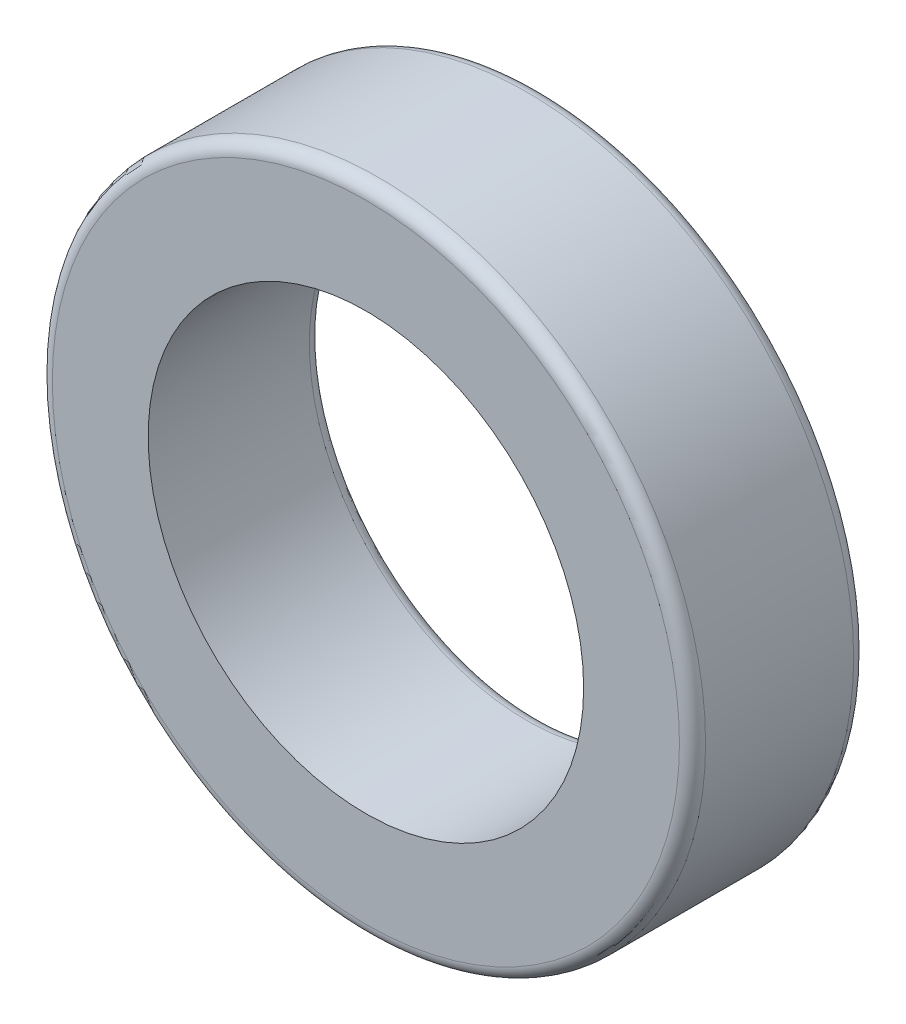
ISO-10303-21;
HEADER;
FILE_DESCRIPTION(('STEP AP214'),'2;1');
FILE_NAME('part.step','',(''),(''),'','','');
FILE_SCHEMA(('AUTOMOTIVE_DESIGN { 1 0 10303 214 1 1 1 1 }'));
ENDSEC;
DATA;
#1=APPLICATION_CONTEXT('core data for automotive mechanical design processes');
#2=APPLICATION_PROTOCOL_DEFINITION('international standard','automotive_design',2000,#1);
#3=PRODUCT_CONTEXT('',#1,'mechanical');
#4=PRODUCT('Part','Part','',(#3));
#5=PRODUCT_RELATED_PRODUCT_CATEGORY('part','',(#4));
#6=PRODUCT_DEFINITION_FORMATION('','',#4);
#7=PRODUCT_DEFINITION_CONTEXT('part definition',#1,'design');
#8=PRODUCT_DEFINITION('design','',#6,#7);
#9=PRODUCT_DEFINITION_SHAPE('','',#8);
#10=(LENGTH_UNIT() NAMED_UNIT(*) SI_UNIT(.MILLI.,.METRE.));
#11=(NAMED_UNIT(*) PLANE_ANGLE_UNIT() SI_UNIT($,.RADIAN.));
#12=(NAMED_UNIT(*) SI_UNIT($,.STERADIAN.) SOLID_ANGLE_UNIT());
#13=UNCERTAINTY_MEASURE_WITH_UNIT(LENGTH_MEASURE(1.E-05),#10,'distance_accuracy_value','');
#14=(GEOMETRIC_REPRESENTATION_CONTEXT(3) GLOBAL_UNCERTAINTY_ASSIGNED_CONTEXT((#13)) GLOBAL_UNIT_ASSIGNED_CONTEXT((#10,
#11,#12)) REPRESENTATION_CONTEXT('',''));
#15=CARTESIAN_POINT('',(0.,0.,0.));
#16=DIRECTION('',(0.,0.,1.));
#17=DIRECTION('',(1.,0.,0.));
#18=AXIS2_PLACEMENT_3D('',#15,#16,#17);
#19=CARTESIAN_POINT('',(0.,0.,2.));
#20=DIRECTION('',(0.,0.,1.));
#21=DIRECTION('',(1.,0.,0.));
#22=AXIS2_PLACEMENT_3D('',#19,#20,#21);
#23=PLANE('',#22);
#24=CARTESIAN_POINT('',(0.,0.,2.));
#25=DIRECTION('',(0.,0.,1.));
#26=DIRECTION('',(1.,0.,0.));
#27=AXIS2_PLACEMENT_3D('',#24,#25,#26);
#28=CIRCLE('',#27,7.2);
#29=CARTESIAN_POINT('',(7.2,0.,2.));
#30=VERTEX_POINT('',#29);
#31=EDGE_CURVE('E50',#30,#30,#28,.T.);
#32=ORIENTED_EDGE('',*,*,#31,.T.);
#33=EDGE_LOOP('',(#32));
#34=FACE_BOUND('',#33,.T.);
#35=CARTESIAN_POINT('',(0.,0.,2.));
#36=DIRECTION('',(0.,0.,1.));
#37=DIRECTION('',(1.,0.,0.));
#38=AXIS2_PLACEMENT_3D('',#35,#36,#37);
#39=CIRCLE('',#38,5.);
#40=CARTESIAN_POINT('',(5.,0.,2.));
#41=VERTEX_POINT('',#40);
#42=EDGE_CURVE('E69',#41,#41,#39,.T.);
#43=ORIENTED_EDGE('',*,*,#42,.F.);
#44=EDGE_LOOP('',(#43));
#45=FACE_BOUND('',#44,.T.);
#46=ADVANCED_FACE('F37',(#34,#45),#23,.T.);
#47=CARTESIAN_POINT('',(0.,0.,-2.));
#48=DIRECTION('',(0.,0.,1.));
#49=DIRECTION('',(1.,0.,0.));
#50=AXIS2_PLACEMENT_3D('',#47,#48,#49);
#51=PLANE('',#50);
#52=CARTESIAN_POINT('',(0.,0.,-2.));
#53=DIRECTION('',(0.,0.,1.));
#54=DIRECTION('',(1.,0.,0.));
#55=AXIS2_PLACEMENT_3D('',#52,#53,#54);
#56=CIRCLE('',#55,5.3);
#57=CARTESIAN_POINT('',(5.3,0.,-2.));
#58=VERTEX_POINT('',#57);
#59=EDGE_CURVE('E61',#58,#58,#56,.T.);
#60=ORIENTED_EDGE('',*,*,#59,.T.);
#61=EDGE_LOOP('',(#60));
#62=FACE_BOUND('',#61,.T.);
#63=CARTESIAN_POINT('',(0.,0.,-2.));
#64=DIRECTION('',(0.,0.,1.));
#65=DIRECTION('',(1.,0.,0.));
#66=AXIS2_PLACEMENT_3D('',#63,#64,#65);
#67=CIRCLE('',#66,7.2);
#68=CARTESIAN_POINT('',(7.2,0.,-2.));
#69=VERTEX_POINT('',#68);
#70=EDGE_CURVE('E65',#69,#69,#67,.F.);
#71=ORIENTED_EDGE('',*,*,#70,.T.);
#72=EDGE_LOOP('',(#71));
#73=FACE_BOUND('',#72,.T.);
#74=ADVANCED_FACE('F77',(#62,#73),#51,.F.);
#75=CARTESIAN_POINT('',(0.,0.,2.));
#76=DIRECTION('',(0.,0.,-1.));
#77=DIRECTION('',(-1.,0.,0.));
#78=AXIS2_PLACEMENT_3D('',#75,#76,#77);
#79=CYLINDRICAL_SURFACE('',#78,7.5);
#80=CARTESIAN_POINT('',(0.,0.,1.7));
#81=DIRECTION('',(0.,0.,1.));
#82=DIRECTION('',(1.,0.,0.));
#83=AXIS2_PLACEMENT_3D('',#80,#81,#82);
#84=CIRCLE('',#83,7.5);
#85=CARTESIAN_POINT('',(7.5,0.,1.7));
#86=VERTEX_POINT('',#85);
#87=EDGE_CURVE('E10',#86,#86,#84,.F.);
#88=ORIENTED_EDGE('',*,*,#87,.T.);
#89=EDGE_LOOP('',(#88));
#90=FACE_BOUND('',#89,.T.);
#91=CARTESIAN_POINT('',(0.,0.,-1.7));
#92=DIRECTION('',(0.,0.,1.));
#93=DIRECTION('',(1.,0.,0.));
#94=AXIS2_PLACEMENT_3D('',#91,#92,#93);
#95=CIRCLE('',#94,7.5);
#96=CARTESIAN_POINT('',(7.5,0.,-1.7));
#97=VERTEX_POINT('',#96);
#98=EDGE_CURVE('E45',#97,#97,#95,.T.);
#99=ORIENTED_EDGE('',*,*,#98,.T.);
#100=EDGE_LOOP('',(#99));
#101=FACE_BOUND('',#100,.T.);
#102=ADVANCED_FACE('F83',(#90,#101),#79,.T.);
#103=CARTESIAN_POINT('',(0.,0.,2.));
#104=DIRECTION('',(0.,0.,-1.));
#105=DIRECTION('',(-1.,0.,0.));
#106=AXIS2_PLACEMENT_3D('',#103,#104,#105);
#107=CYLINDRICAL_SURFACE('',#106,5.);
#108=CARTESIAN_POINT('',(0.,0.,-1.7));
#109=DIRECTION('',(0.,0.,1.));
#110=DIRECTION('',(1.,0.,0.));
#111=AXIS2_PLACEMENT_3D('',#108,#109,#110);
#112=CIRCLE('',#111,5.);
#113=CARTESIAN_POINT('',(5.,0.,-1.7));
#114=VERTEX_POINT('',#113);
#115=EDGE_CURVE('E55',#114,#114,#112,.F.);
#116=ORIENTED_EDGE('',*,*,#115,.T.);
#117=EDGE_LOOP('',(#116));
#118=FACE_BOUND('',#117,.T.);
#119=ORIENTED_EDGE('',*,*,#42,.T.);
#120=EDGE_LOOP('',(#119));
#121=FACE_BOUND('',#120,.T.);
#122=ADVANCED_FACE('F74',(#118,#121),#107,.F.);
#123=CARTESIAN_POINT('',(0.,0.,-1.7));
#124=DIRECTION('',(0.,0.,1.));
#125=DIRECTION('',(1.,0.,0.));
#126=AXIS2_PLACEMENT_3D('',#123,#124,#125);
#127=TOROIDAL_SURFACE('',#126,5.3,0.3);
#128=ORIENTED_EDGE('',*,*,#115,.F.);
#129=EDGE_LOOP('',(#128));
#130=FACE_BOUND('',#129,.T.);
#131=ORIENTED_EDGE('',*,*,#59,.F.);
#132=EDGE_LOOP('',(#131));
#133=FACE_BOUND('',#132,.T.);
#134=ADVANCED_FACE('F90',(#130,#133),#127,.T.);
#135=CARTESIAN_POINT('',(0.,0.,1.7));
#136=DIRECTION('',(0.,0.,1.));
#137=DIRECTION('',(1.,0.,0.));
#138=AXIS2_PLACEMENT_3D('',#135,#136,#137);
#139=TOROIDAL_SURFACE('',#138,7.2,0.3);
#140=ORIENTED_EDGE('',*,*,#87,.F.);
#141=EDGE_LOOP('',(#140));
#142=FACE_BOUND('',#141,.T.);
#143=ORIENTED_EDGE('',*,*,#31,.F.);
#144=EDGE_LOOP('',(#143));
#145=FACE_BOUND('',#144,.T.);
#146=ADVANCED_FACE('F92',(#142,#145),#139,.T.);
#147=CARTESIAN_POINT('',(0.,0.,-1.7));
#148=DIRECTION('',(0.,0.,1.));
#149=DIRECTION('',(1.,0.,0.));
#150=AXIS2_PLACEMENT_3D('',#147,#148,#149);
#151=TOROIDAL_SURFACE('',#150,7.2,0.3);
#152=ORIENTED_EDGE('',*,*,#70,.F.);
#153=EDGE_LOOP('',(#152));
#154=FACE_BOUND('',#153,.T.);
#155=ORIENTED_EDGE('',*,*,#98,.F.);
#156=EDGE_LOOP('',(#155));
#157=FACE_BOUND('',#156,.T.);
#158=ADVANCED_FACE('F39',(#154,#157),#151,.T.);
#159=CLOSED_SHELL('',(#46,#74,#102,#122,#134,#146,#158));
#160=MANIFOLD_SOLID_BREP('B2',#159);
#161=ADVANCED_BREP_SHAPE_REPRESENTATION('',(#18,#160),#14);
#162=SHAPE_DEFINITION_REPRESENTATION(#9,#161);
ENDSEC;
END-ISO-10303-21;
